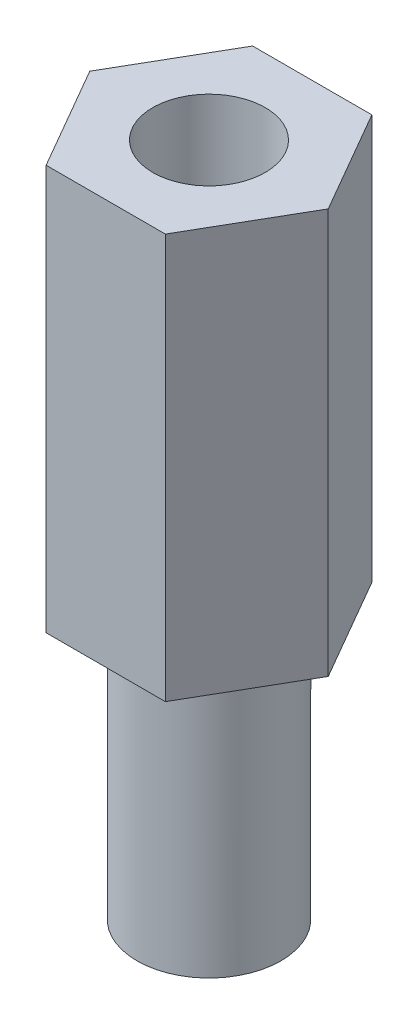
ISO-10303-21;
HEADER;
FILE_DESCRIPTION(('STEP AP214'),'2;1');
FILE_NAME('part.step','',(''),(''),'','','');
FILE_SCHEMA(('AUTOMOTIVE_DESIGN { 1 0 10303 214 1 1 1 1 }'));
ENDSEC;
DATA;
#1=APPLICATION_CONTEXT('core data for automotive mechanical design processes');
#2=APPLICATION_PROTOCOL_DEFINITION('international standard','automotive_design',2000,#1);
#3=PRODUCT_CONTEXT('',#1,'mechanical');
#4=PRODUCT('Part','Part','',(#3));
#5=PRODUCT_RELATED_PRODUCT_CATEGORY('part','',(#4));
#6=PRODUCT_DEFINITION_FORMATION('','',#4);
#7=PRODUCT_DEFINITION_CONTEXT('part definition',#1,'design');
#8=PRODUCT_DEFINITION('design','',#6,#7);
#9=PRODUCT_DEFINITION_SHAPE('','',#8);
#10=(LENGTH_UNIT() NAMED_UNIT(*) SI_UNIT(.MILLI.,.METRE.));
#11=(NAMED_UNIT(*) PLANE_ANGLE_UNIT() SI_UNIT($,.RADIAN.));
#12=(NAMED_UNIT(*) SI_UNIT($,.STERADIAN.) SOLID_ANGLE_UNIT());
#13=UNCERTAINTY_MEASURE_WITH_UNIT(LENGTH_MEASURE(1.E-05),#10,'distance_accuracy_value','');
#14=(GEOMETRIC_REPRESENTATION_CONTEXT(3) GLOBAL_UNCERTAINTY_ASSIGNED_CONTEXT((#13)) GLOBAL_UNIT_ASSIGNED_CONTEXT((#10,
#11,#12)) REPRESENTATION_CONTEXT('',''));
#15=CARTESIAN_POINT('',(0.,0.,0.));
#16=DIRECTION('',(0.,0.,1.));
#17=DIRECTION('',(1.,0.,0.));
#18=AXIS2_PLACEMENT_3D('',#15,#16,#17);
#19=CARTESIAN_POINT('',(-1.325,9.,2.29496732002876));
#20=DIRECTION('',(0.,0.,-1.));
#21=DIRECTION('',(-1.,0.,0.));
#22=AXIS2_PLACEMENT_3D('',#19,#20,#21);
#23=PLANE('',#22);
#24=DIRECTION('',(1.,0.,0.));
#25=VECTOR('',#24,1.);
#26=CARTESIAN_POINT('',(-1.325,0.,2.29496732002876));
#27=LINE('',#26,#25);
#28=CARTESIAN_POINT('',(-1.325,0.,2.29496732002876));
#29=VERTEX_POINT('',#28);
#30=CARTESIAN_POINT('',(1.325,0.,2.29496732002876));
#31=VERTEX_POINT('',#30);
#32=EDGE_CURVE('E122',#29,#31,#27,.T.);
#33=ORIENTED_EDGE('',*,*,#32,.T.);
#34=DIRECTION('',(0.,-1.,0.));
#35=VECTOR('',#34,1.);
#36=CARTESIAN_POINT('',(1.325,9.,2.29496732002876));
#37=LINE('',#36,#35);
#38=CARTESIAN_POINT('',(1.325,9.,2.29496732002876));
#39=VERTEX_POINT('',#38);
#40=EDGE_CURVE('E45',#39,#31,#37,.T.);
#41=ORIENTED_EDGE('',*,*,#40,.F.);
#42=DIRECTION('',(1.,0.,0.));
#43=VECTOR('',#42,1.);
#44=CARTESIAN_POINT('',(-1.325,9.,2.29496732002876));
#45=LINE('',#44,#43);
#46=CARTESIAN_POINT('',(-1.325,9.,2.29496732002876));
#47=VERTEX_POINT('',#46);
#48=EDGE_CURVE('E133',#47,#39,#45,.T.);
#49=ORIENTED_EDGE('',*,*,#48,.F.);
#50=DIRECTION('',(0.,-1.,0.));
#51=VECTOR('',#50,1.);
#52=CARTESIAN_POINT('',(-1.325,9.,2.29496732002876));
#53=LINE('',#52,#51);
#54=EDGE_CURVE('E118',#47,#29,#53,.T.);
#55=ORIENTED_EDGE('',*,*,#54,.T.);
#56=EDGE_LOOP('',(#33,#41,#49,#55));
#57=FACE_BOUND('',#56,.T.);
#58=ADVANCED_FACE('F37',(#57),#23,.F.);
#59=CARTESIAN_POINT('',(1.325,9.,2.29496732002876));
#60=DIRECTION('',(-0.866025403784439,0.,-0.5));
#61=DIRECTION('',(-0.5,0.,0.866025403784439));
#62=AXIS2_PLACEMENT_3D('',#59,#60,#61);
#63=PLANE('',#62);
#64=DIRECTION('',(0.5,0.,-0.866025403784439));
#65=VECTOR('',#64,1.);
#66=CARTESIAN_POINT('',(1.325,0.,2.29496732002876));
#67=LINE('',#66,#65);
#68=CARTESIAN_POINT('',(2.65,0.,0.));
#69=VERTEX_POINT('',#68);
#70=EDGE_CURVE('E125',#31,#69,#67,.T.);
#71=ORIENTED_EDGE('',*,*,#70,.T.);
#72=DIRECTION('',(0.,-1.,0.));
#73=VECTOR('',#72,1.);
#74=CARTESIAN_POINT('',(2.65,9.,0.));
#75=LINE('',#74,#73);
#76=CARTESIAN_POINT('',(2.65,9.,0.));
#77=VERTEX_POINT('',#76);
#78=EDGE_CURVE('E137',#77,#69,#75,.T.);
#79=ORIENTED_EDGE('',*,*,#78,.F.);
#80=DIRECTION('',(0.5,0.,-0.866025403784439));
#81=VECTOR('',#80,1.);
#82=CARTESIAN_POINT('',(1.325,9.,2.29496732002876));
#83=LINE('',#82,#81);
#84=EDGE_CURVE('E91',#39,#77,#83,.T.);
#85=ORIENTED_EDGE('',*,*,#84,.F.);
#86=ORIENTED_EDGE('',*,*,#40,.T.);
#87=EDGE_LOOP('',(#71,#79,#85,#86));
#88=FACE_BOUND('',#87,.T.);
#89=ADVANCED_FACE('F140',(#88),#63,.F.);
#90=CARTESIAN_POINT('',(2.65,9.,0.));
#91=DIRECTION('',(-0.866025403784438,0.,0.5));
#92=DIRECTION('',(0.5,0.,0.866025403784439));
#93=AXIS2_PLACEMENT_3D('',#90,#91,#92);
#94=PLANE('',#93);
#95=DIRECTION('',(-0.5,0.,-0.866025403784439));
#96=VECTOR('',#95,1.);
#97=CARTESIAN_POINT('',(2.65,0.,0.));
#98=LINE('',#97,#96);
#99=CARTESIAN_POINT('',(1.325,0.,-2.29496732002876));
#100=VERTEX_POINT('',#99);
#101=EDGE_CURVE('E128',#69,#100,#98,.T.);
#102=ORIENTED_EDGE('',*,*,#101,.T.);
#103=DIRECTION('',(0.,-1.,0.));
#104=VECTOR('',#103,1.);
#105=CARTESIAN_POINT('',(1.325,9.,-2.29496732002876));
#106=LINE('',#105,#104);
#107=CARTESIAN_POINT('',(1.325,9.,-2.29496732002876));
#108=VERTEX_POINT('',#107);
#109=EDGE_CURVE('E113',#108,#100,#106,.T.);
#110=ORIENTED_EDGE('',*,*,#109,.F.);
#111=DIRECTION('',(-0.5,0.,-0.866025403784439));
#112=VECTOR('',#111,1.);
#113=CARTESIAN_POINT('',(2.65,9.,0.));
#114=LINE('',#113,#112);
#115=EDGE_CURVE('E104',#77,#108,#114,.T.);
#116=ORIENTED_EDGE('',*,*,#115,.F.);
#117=ORIENTED_EDGE('',*,*,#78,.T.);
#118=EDGE_LOOP('',(#102,#110,#116,#117));
#119=FACE_BOUND('',#118,.T.);
#120=ADVANCED_FACE('F148',(#119),#94,.F.);
#121=CARTESIAN_POINT('',(1.325,9.,-2.29496732002876));
#122=DIRECTION('',(0.,0.,1.));
#123=DIRECTION('',(1.,0.,0.));
#124=AXIS2_PLACEMENT_3D('',#121,#122,#123);
#125=PLANE('',#124);
#126=DIRECTION('',(-1.,0.,0.));
#127=VECTOR('',#126,1.);
#128=CARTESIAN_POINT('',(1.325,0.,-2.29496732002876));
#129=LINE('',#128,#127);
#130=CARTESIAN_POINT('',(-1.325,0.,-2.29496732002876));
#131=VERTEX_POINT('',#130);
#132=EDGE_CURVE('E112',#100,#131,#129,.T.);
#133=ORIENTED_EDGE('',*,*,#132,.T.);
#134=DIRECTION('',(0.,-1.,0.));
#135=VECTOR('',#134,1.);
#136=CARTESIAN_POINT('',(-1.325,9.,-2.29496732002876));
#137=LINE('',#136,#135);
#138=CARTESIAN_POINT('',(-1.325,9.,-2.29496732002876));
#139=VERTEX_POINT('',#138);
#140=EDGE_CURVE('E109',#139,#131,#137,.T.);
#141=ORIENTED_EDGE('',*,*,#140,.F.);
#142=DIRECTION('',(-1.,0.,0.));
#143=VECTOR('',#142,1.);
#144=CARTESIAN_POINT('',(1.325,9.,-2.29496732002876));
#145=LINE('',#144,#143);
#146=EDGE_CURVE('E98',#108,#139,#145,.T.);
#147=ORIENTED_EDGE('',*,*,#146,.F.);
#148=ORIENTED_EDGE('',*,*,#109,.T.);
#149=EDGE_LOOP('',(#133,#141,#147,#148));
#150=FACE_BOUND('',#149,.T.);
#151=ADVANCED_FACE('F110',(#150),#125,.F.);
#152=CARTESIAN_POINT('',(-1.325,9.,-2.29496732002876));
#153=DIRECTION('',(0.866025403784439,0.,0.5));
#154=DIRECTION('',(0.5,0.,-0.866025403784439));
#155=AXIS2_PLACEMENT_3D('',#152,#153,#154);
#156=PLANE('',#155);
#157=DIRECTION('',(-0.5,0.,0.866025403784439));
#158=VECTOR('',#157,1.);
#159=CARTESIAN_POINT('',(-1.325,0.,-2.29496732002876));
#160=LINE('',#159,#158);
#161=CARTESIAN_POINT('',(-2.65,0.,0.));
#162=VERTEX_POINT('',#161);
#163=EDGE_CURVE('E76',#131,#162,#160,.T.);
#164=ORIENTED_EDGE('',*,*,#163,.T.);
#165=DIRECTION('',(0.,-1.,0.));
#166=VECTOR('',#165,1.);
#167=CARTESIAN_POINT('',(-2.65,9.,0.));
#168=LINE('',#167,#166);
#169=CARTESIAN_POINT('',(-2.65,9.,0.));
#170=VERTEX_POINT('',#169);
#171=EDGE_CURVE('E114',#170,#162,#168,.T.);
#172=ORIENTED_EDGE('',*,*,#171,.F.);
#173=DIRECTION('',(-0.5,0.,0.866025403784439));
#174=VECTOR('',#173,1.);
#175=CARTESIAN_POINT('',(-1.325,9.,-2.29496732002876));
#176=LINE('',#175,#174);
#177=EDGE_CURVE('E102',#139,#170,#176,.T.);
#178=ORIENTED_EDGE('',*,*,#177,.F.);
#179=ORIENTED_EDGE('',*,*,#140,.T.);
#180=EDGE_LOOP('',(#164,#172,#178,#179));
#181=FACE_BOUND('',#180,.T.);
#182=ADVANCED_FACE('F116',(#181),#156,.F.);
#183=CARTESIAN_POINT('',(-2.65,9.,0.));
#184=DIRECTION('',(0.866025403784438,0.,-0.5));
#185=DIRECTION('',(-0.5,0.,-0.866025403784439));
#186=AXIS2_PLACEMENT_3D('',#183,#184,#185);
#187=PLANE('',#186);
#188=DIRECTION('',(0.5,0.,0.866025403784439));
#189=VECTOR('',#188,1.);
#190=CARTESIAN_POINT('',(-2.65,0.,0.));
#191=LINE('',#190,#189);
#192=EDGE_CURVE('E82',#162,#29,#191,.T.);
#193=ORIENTED_EDGE('',*,*,#192,.T.);
#194=ORIENTED_EDGE('',*,*,#54,.F.);
#195=DIRECTION('',(0.5,0.,0.866025403784439));
#196=VECTOR('',#195,1.);
#197=CARTESIAN_POINT('',(-2.65,9.,0.));
#198=LINE('',#197,#196);
#199=EDGE_CURVE('E53',#170,#47,#198,.T.);
#200=ORIENTED_EDGE('',*,*,#199,.F.);
#201=ORIENTED_EDGE('',*,*,#171,.T.);
#202=EDGE_LOOP('',(#193,#194,#200,#201));
#203=FACE_BOUND('',#202,.T.);
#204=ADVANCED_FACE('F171',(#203),#187,.F.);
#205=CARTESIAN_POINT('',(0.,9.,0.));
#206=DIRECTION('',(0.,1.,0.));
#207=DIRECTION('',(0.,0.,1.));
#208=AXIS2_PLACEMENT_3D('',#205,#206,#207);
#209=PLANE('',#208);
#210=CARTESIAN_POINT('',(0.,9.,0.));
#211=DIRECTION('',(0.,1.,0.));
#212=DIRECTION('',(0.,0.,1.));
#213=AXIS2_PLACEMENT_3D('',#210,#211,#212);
#214=CIRCLE('',#213,1.25);
#215=CARTESIAN_POINT('',(0.,9.,1.25));
#216=VERTEX_POINT('',#215);
#217=EDGE_CURVE('E155',#216,#216,#214,.T.);
#218=ORIENTED_EDGE('',*,*,#217,.F.);
#219=EDGE_LOOP('',(#218));
#220=FACE_BOUND('',#219,.T.);
#221=ORIENTED_EDGE('',*,*,#48,.T.);
#222=ORIENTED_EDGE('',*,*,#84,.T.);
#223=ORIENTED_EDGE('',*,*,#115,.T.);
#224=ORIENTED_EDGE('',*,*,#146,.T.);
#225=ORIENTED_EDGE('',*,*,#177,.T.);
#226=ORIENTED_EDGE('',*,*,#199,.T.);
#227=EDGE_LOOP('',(#221,#222,#223,#224,#225,#226));
#228=FACE_BOUND('',#227,.T.);
#229=ADVANCED_FACE('F100',(#220,#228),#209,.T.);
#230=CARTESIAN_POINT('',(0.,0.,0.));
#231=DIRECTION('',(0.,1.,0.));
#232=DIRECTION('',(0.,0.,1.));
#233=AXIS2_PLACEMENT_3D('',#230,#231,#232);
#234=PLANE('',#233);
#235=CARTESIAN_POINT('',(0.,0.,0.));
#236=DIRECTION('',(0.,1.,0.));
#237=DIRECTION('',(0.,0.,1.));
#238=AXIS2_PLACEMENT_3D('',#235,#236,#237);
#239=CIRCLE('',#238,1.6);
#240=CARTESIAN_POINT('',(0.,0.,1.6));
#241=VERTEX_POINT('',#240);
#242=EDGE_CURVE('E11',#241,#241,#239,.F.);
#243=ORIENTED_EDGE('',*,*,#242,.F.);
#244=EDGE_LOOP('',(#243));
#245=FACE_BOUND('',#244,.T.);
#246=ORIENTED_EDGE('',*,*,#32,.F.);
#247=ORIENTED_EDGE('',*,*,#192,.F.);
#248=ORIENTED_EDGE('',*,*,#163,.F.);
#249=ORIENTED_EDGE('',*,*,#132,.F.);
#250=ORIENTED_EDGE('',*,*,#101,.F.);
#251=ORIENTED_EDGE('',*,*,#70,.F.);
#252=EDGE_LOOP('',(#246,#247,#248,#249,#250,#251));
#253=FACE_BOUND('',#252,.T.);
#254=ADVANCED_FACE('F145',(#245,#253),#234,.F.);
#255=CARTESIAN_POINT('',(0.,-6.,0.));
#256=DIRECTION('',(0.,1.,0.));
#257=DIRECTION('',(0.,0.,1.));
#258=AXIS2_PLACEMENT_3D('',#255,#256,#257);
#259=CYLINDRICAL_SURFACE('',#258,1.6);
#260=CARTESIAN_POINT('',(0.,-6.,0.));
#261=DIRECTION('',(0.,-1.,0.));
#262=DIRECTION('',(0.,0.,-1.));
#263=AXIS2_PLACEMENT_3D('',#260,#261,#262);
#264=CIRCLE('',#263,1.6);
#265=CARTESIAN_POINT('',(0.,-6.,-1.6));
#266=VERTEX_POINT('',#265);
#267=EDGE_CURVE('E126',#266,#266,#264,.T.);
#268=ORIENTED_EDGE('',*,*,#267,.F.);
#269=EDGE_LOOP('',(#268));
#270=FACE_BOUND('',#269,.T.);
#271=ORIENTED_EDGE('',*,*,#242,.T.);
#272=EDGE_LOOP('',(#271));
#273=FACE_BOUND('',#272,.T.);
#274=ADVANCED_FACE('F177',(#270,#273),#259,.T.);
#275=CARTESIAN_POINT('',(0.,-6.,0.));
#276=DIRECTION('',(0.,-1.,0.));
#277=DIRECTION('',(0.,0.,-1.));
#278=AXIS2_PLACEMENT_3D('',#275,#276,#277);
#279=PLANE('',#278);
#280=ORIENTED_EDGE('',*,*,#267,.T.);
#281=EDGE_LOOP('',(#280));
#282=FACE_BOUND('',#281,.T.);
#283=ADVANCED_FACE('F166',(#282),#279,.T.);
#284=CARTESIAN_POINT('',(0.,4.,0.));
#285=DIRECTION('',(0.,1.,0.));
#286=DIRECTION('',(0.,0.,1.));
#287=AXIS2_PLACEMENT_3D('',#284,#285,#286);
#288=CYLINDRICAL_SURFACE('',#287,1.25);
#289=CARTESIAN_POINT('',(0.,4.,0.));
#290=DIRECTION('',(0.,1.,0.));
#291=DIRECTION('',(0.,0.,1.));
#292=AXIS2_PLACEMENT_3D('',#289,#290,#291);
#293=CIRCLE('',#292,1.25);
#294=CARTESIAN_POINT('',(0.,4.,1.25));
#295=VERTEX_POINT('',#294);
#296=EDGE_CURVE('E154',#295,#295,#293,.T.);
#297=ORIENTED_EDGE('',*,*,#296,.F.);
#298=EDGE_LOOP('',(#297));
#299=FACE_BOUND('',#298,.T.);
#300=ORIENTED_EDGE('',*,*,#217,.T.);
#301=EDGE_LOOP('',(#300));
#302=FACE_BOUND('',#301,.T.);
#303=ADVANCED_FACE('F163',(#299,#302),#288,.F.);
#304=CARTESIAN_POINT('',(0.,4.,0.));
#305=DIRECTION('',(0.,1.,0.));
#306=DIRECTION('',(0.,0.,1.));
#307=AXIS2_PLACEMENT_3D('',#304,#305,#306);
#308=PLANE('',#307);
#309=ORIENTED_EDGE('',*,*,#296,.T.);
#310=EDGE_LOOP('',(#309));
#311=FACE_BOUND('',#310,.T.);
#312=ADVANCED_FACE('F161',(#311),#308,.T.);
#313=CLOSED_SHELL('',(#58,#89,#120,#151,#182,#204,#229,#254,#274,#283,#303,#312));
#314=MANIFOLD_SOLID_BREP('B2',#313);
#315=ADVANCED_BREP_SHAPE_REPRESENTATION('',(#18,#314),#14);
#316=SHAPE_DEFINITION_REPRESENTATION(#9,#315);
ENDSEC;
END-ISO-10303-21;
